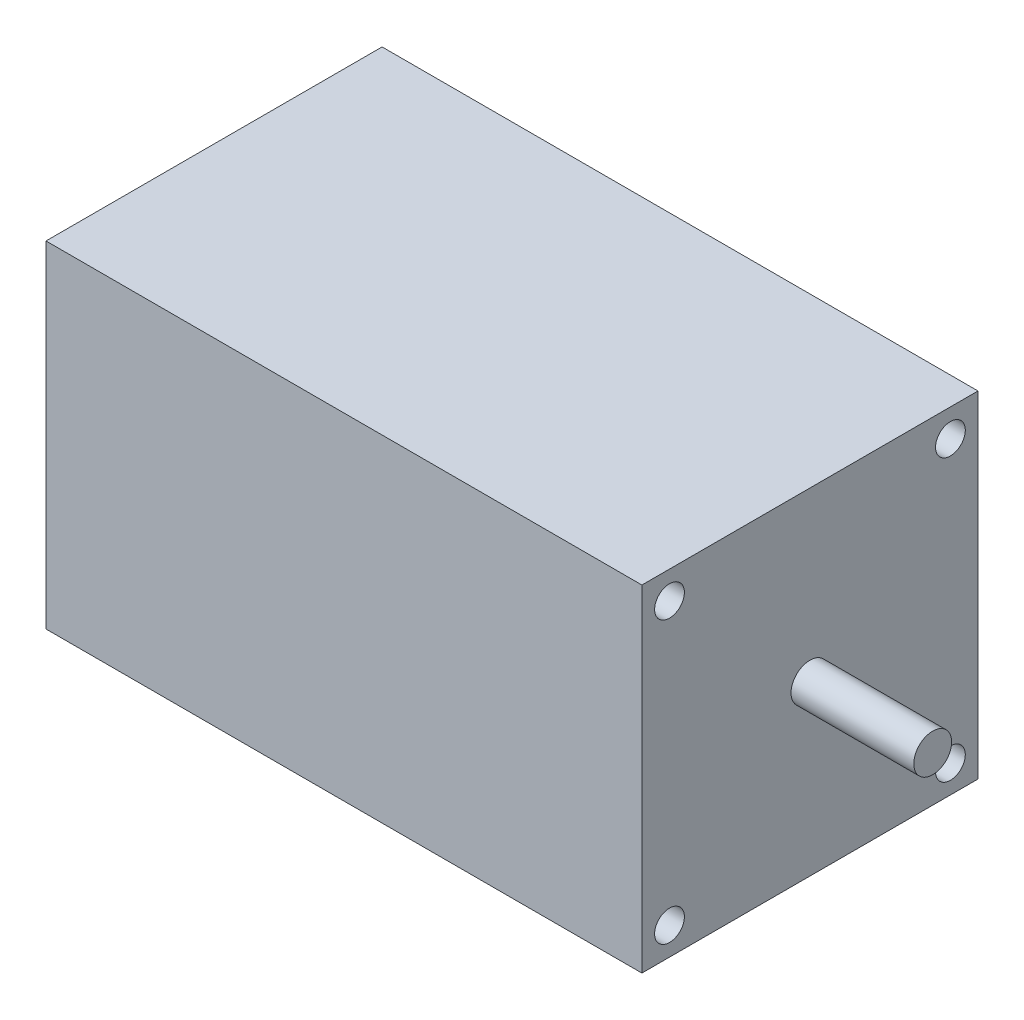
ISO-10303-21;
HEADER;
FILE_DESCRIPTION(('STEP AP214'),'2;1');
FILE_NAME('part.step','',(''),(''),'','','');
FILE_SCHEMA(('AUTOMOTIVE_DESIGN { 1 0 10303 214 1 1 1 1 }'));
ENDSEC;
DATA;
#1=APPLICATION_CONTEXT('core data for automotive mechanical design processes');
#2=APPLICATION_PROTOCOL_DEFINITION('international standard','automotive_design',2000,#1);
#3=PRODUCT_CONTEXT('',#1,'mechanical');
#4=PRODUCT('Part','Part','',(#3));
#5=PRODUCT_RELATED_PRODUCT_CATEGORY('part','',(#4));
#6=PRODUCT_DEFINITION_FORMATION('','',#4);
#7=PRODUCT_DEFINITION_CONTEXT('part definition',#1,'design');
#8=PRODUCT_DEFINITION('design','',#6,#7);
#9=PRODUCT_DEFINITION_SHAPE('','',#8);
#10=(LENGTH_UNIT() NAMED_UNIT(*) SI_UNIT(.MILLI.,.METRE.));
#11=(NAMED_UNIT(*) PLANE_ANGLE_UNIT() SI_UNIT($,.RADIAN.));
#12=(NAMED_UNIT(*) SI_UNIT($,.STERADIAN.) SOLID_ANGLE_UNIT());
#13=UNCERTAINTY_MEASURE_WITH_UNIT(LENGTH_MEASURE(1.E-05),#10,'distance_accuracy_value','');
#14=(GEOMETRIC_REPRESENTATION_CONTEXT(3) GLOBAL_UNCERTAINTY_ASSIGNED_CONTEXT((#13)) GLOBAL_UNIT_ASSIGNED_CONTEXT((#10,
#11,#12)) REPRESENTATION_CONTEXT('',''));
#15=CARTESIAN_POINT('',(0.,0.,0.));
#16=DIRECTION('',(0.,0.,1.));
#17=DIRECTION('',(1.,0.,0.));
#18=AXIS2_PLACEMENT_3D('',#15,#16,#17);
#19=CARTESIAN_POINT('',(-100.,-28.2,-28.2));
#20=DIRECTION('',(0.,0.,-1.));
#21=DIRECTION('',(-1.,0.,0.));
#22=AXIS2_PLACEMENT_3D('',#19,#20,#21);
#23=PLANE('',#22);
#24=DIRECTION('',(0.,1.,0.));
#25=VECTOR('',#24,1.);
#26=CARTESIAN_POINT('',(0.,-28.2,-28.2));
#27=LINE('',#26,#25);
#28=CARTESIAN_POINT('',(0.,-28.2,-28.2));
#29=VERTEX_POINT('',#28);
#30=CARTESIAN_POINT('',(0.,28.2,-28.2));
#31=VERTEX_POINT('',#30);
#32=EDGE_CURVE('E112',#29,#31,#27,.T.);
#33=ORIENTED_EDGE('',*,*,#32,.F.);
#34=DIRECTION('',(1.,0.,0.));
#35=VECTOR('',#34,1.);
#36=CARTESIAN_POINT('',(-100.,-28.2,-28.2));
#37=LINE('',#36,#35);
#38=CARTESIAN_POINT('',(-100.,-28.2,-28.2));
#39=VERTEX_POINT('',#38);
#40=EDGE_CURVE('E48',#39,#29,#37,.T.);
#41=ORIENTED_EDGE('',*,*,#40,.F.);
#42=DIRECTION('',(0.,1.,0.));
#43=VECTOR('',#42,1.);
#44=CARTESIAN_POINT('',(-100.,-28.2,-28.2));
#45=LINE('',#44,#43);
#46=CARTESIAN_POINT('',(-100.,28.2,-28.2));
#47=VERTEX_POINT('',#46);
#48=EDGE_CURVE('E103',#39,#47,#45,.T.);
#49=ORIENTED_EDGE('',*,*,#48,.T.);
#50=DIRECTION('',(1.,0.,0.));
#51=VECTOR('',#50,1.);
#52=CARTESIAN_POINT('',(-100.,28.2,-28.2));
#53=LINE('',#52,#51);
#54=EDGE_CURVE('E83',#47,#31,#53,.T.);
#55=ORIENTED_EDGE('',*,*,#54,.T.);
#56=EDGE_LOOP('',(#33,#41,#49,#55));
#57=FACE_BOUND('',#56,.T.);
#58=ADVANCED_FACE('F39',(#57),#23,.T.);
#59=CARTESIAN_POINT('',(-100.,-28.2,28.2));
#60=DIRECTION('',(0.,-1.,0.));
#61=DIRECTION('',(0.,0.,-1.));
#62=AXIS2_PLACEMENT_3D('',#59,#60,#61);
#63=PLANE('',#62);
#64=DIRECTION('',(0.,0.,-1.));
#65=VECTOR('',#64,1.);
#66=CARTESIAN_POINT('',(0.,-28.2,28.2));
#67=LINE('',#66,#65);
#68=CARTESIAN_POINT('',(0.,-28.2,28.2));
#69=VERTEX_POINT('',#68);
#70=EDGE_CURVE('E106',#69,#29,#67,.T.);
#71=ORIENTED_EDGE('',*,*,#70,.F.);
#72=DIRECTION('',(1.,0.,0.));
#73=VECTOR('',#72,1.);
#74=CARTESIAN_POINT('',(-100.,-28.2,28.2));
#75=LINE('',#74,#73);
#76=CARTESIAN_POINT('',(-100.,-28.2,28.2));
#77=VERTEX_POINT('',#76);
#78=EDGE_CURVE('E72',#77,#69,#75,.T.);
#79=ORIENTED_EDGE('',*,*,#78,.F.);
#80=DIRECTION('',(0.,0.,-1.));
#81=VECTOR('',#80,1.);
#82=CARTESIAN_POINT('',(-100.,-28.2,28.2));
#83=LINE('',#82,#81);
#84=EDGE_CURVE('E98',#77,#39,#83,.T.);
#85=ORIENTED_EDGE('',*,*,#84,.T.);
#86=ORIENTED_EDGE('',*,*,#40,.T.);
#87=EDGE_LOOP('',(#71,#79,#85,#86));
#88=FACE_BOUND('',#87,.T.);
#89=ADVANCED_FACE('F131',(#88),#63,.T.);
#90=CARTESIAN_POINT('',(-100.,-28.2,28.2));
#91=DIRECTION('',(0.,0.,1.));
#92=DIRECTION('',(1.,0.,0.));
#93=AXIS2_PLACEMENT_3D('',#90,#91,#92);
#94=PLANE('',#93);
#95=DIRECTION('',(0.,-1.,0.));
#96=VECTOR('',#95,1.);
#97=CARTESIAN_POINT('',(0.,-28.2,28.2));
#98=LINE('',#97,#96);
#99=CARTESIAN_POINT('',(0.,28.2,28.2));
#100=VERTEX_POINT('',#99);
#101=EDGE_CURVE('E91',#100,#69,#98,.T.);
#102=ORIENTED_EDGE('',*,*,#101,.F.);
#103=DIRECTION('',(1.,0.,0.));
#104=VECTOR('',#103,1.);
#105=CARTESIAN_POINT('',(-100.,28.2,28.2));
#106=LINE('',#105,#104);
#107=CARTESIAN_POINT('',(-100.,28.2,28.2));
#108=VERTEX_POINT('',#107);
#109=EDGE_CURVE('E86',#108,#100,#106,.T.);
#110=ORIENTED_EDGE('',*,*,#109,.F.);
#111=DIRECTION('',(0.,-1.,0.));
#112=VECTOR('',#111,1.);
#113=CARTESIAN_POINT('',(-100.,-28.2,28.2));
#114=LINE('',#113,#112);
#115=EDGE_CURVE('E89',#108,#77,#114,.T.);
#116=ORIENTED_EDGE('',*,*,#115,.T.);
#117=ORIENTED_EDGE('',*,*,#78,.T.);
#118=EDGE_LOOP('',(#102,#110,#116,#117));
#119=FACE_BOUND('',#118,.T.);
#120=ADVANCED_FACE('F88',(#119),#94,.T.);
#121=CARTESIAN_POINT('',(-100.,28.2,28.2));
#122=DIRECTION('',(0.,1.,0.));
#123=DIRECTION('',(0.,0.,1.));
#124=AXIS2_PLACEMENT_3D('',#121,#122,#123);
#125=PLANE('',#124);
#126=DIRECTION('',(0.,0.,1.));
#127=VECTOR('',#126,1.);
#128=CARTESIAN_POINT('',(0.,28.2,28.2));
#129=LINE('',#128,#127);
#130=EDGE_CURVE('E116',#31,#100,#129,.T.);
#131=ORIENTED_EDGE('',*,*,#130,.F.);
#132=ORIENTED_EDGE('',*,*,#54,.F.);
#133=DIRECTION('',(0.,0.,1.));
#134=VECTOR('',#133,1.);
#135=CARTESIAN_POINT('',(-100.,28.2,28.2));
#136=LINE('',#135,#134);
#137=EDGE_CURVE('E97',#47,#108,#136,.T.);
#138=ORIENTED_EDGE('',*,*,#137,.T.);
#139=ORIENTED_EDGE('',*,*,#109,.T.);
#140=EDGE_LOOP('',(#131,#132,#138,#139));
#141=FACE_BOUND('',#140,.T.);
#142=ADVANCED_FACE('F101',(#141),#125,.T.);
#143=CARTESIAN_POINT('',(-100.,0.,0.));
#144=DIRECTION('',(-1.,0.,0.));
#145=DIRECTION('',(0.,0.,1.));
#146=AXIS2_PLACEMENT_3D('',#143,#144,#145);
#147=PLANE('',#146);
#148=CARTESIAN_POINT('',(-100.,-23.57,23.57));
#149=DIRECTION('',(-1.,0.,0.));
#150=DIRECTION('',(0.,0.,1.));
#151=AXIS2_PLACEMENT_3D('',#148,#149,#150);
#152=CIRCLE('',#151,2.5);
#153=CARTESIAN_POINT('',(-100.,-23.57,26.07));
#154=VERTEX_POINT('',#153);
#155=EDGE_CURVE('E186',#154,#154,#152,.F.);
#156=ORIENTED_EDGE('',*,*,#155,.T.);
#157=EDGE_LOOP('',(#156));
#158=FACE_BOUND('',#157,.T.);
#159=CARTESIAN_POINT('',(-100.,-23.57,-23.57));
#160=DIRECTION('',(-1.,0.,0.));
#161=DIRECTION('',(0.,0.,1.));
#162=AXIS2_PLACEMENT_3D('',#159,#160,#161);
#163=CIRCLE('',#162,2.5);
#164=CARTESIAN_POINT('',(-100.,-23.57,-21.07));
#165=VERTEX_POINT('',#164);
#166=EDGE_CURVE('E194',#165,#165,#163,.F.);
#167=ORIENTED_EDGE('',*,*,#166,.T.);
#168=EDGE_LOOP('',(#167));
#169=FACE_BOUND('',#168,.T.);
#170=CARTESIAN_POINT('',(-100.,23.57,-23.57));
#171=DIRECTION('',(-1.,0.,0.));
#172=DIRECTION('',(0.,0.,1.));
#173=AXIS2_PLACEMENT_3D('',#170,#171,#172);
#174=CIRCLE('',#173,2.5);
#175=CARTESIAN_POINT('',(-100.,23.57,-21.07));
#176=VERTEX_POINT('',#175);
#177=EDGE_CURVE('E193',#176,#176,#174,.F.);
#178=ORIENTED_EDGE('',*,*,#177,.T.);
#179=EDGE_LOOP('',(#178));
#180=FACE_BOUND('',#179,.T.);
#181=CARTESIAN_POINT('',(-100.,23.57,23.57));
#182=DIRECTION('',(-1.,0.,0.));
#183=DIRECTION('',(0.,0.,1.));
#184=AXIS2_PLACEMENT_3D('',#181,#182,#183);
#185=CIRCLE('',#184,2.5);
#186=CARTESIAN_POINT('',(-100.,23.57,26.07));
#187=VERTEX_POINT('',#186);
#188=EDGE_CURVE('E117',#187,#187,#185,.F.);
#189=ORIENTED_EDGE('',*,*,#188,.T.);
#190=EDGE_LOOP('',(#189));
#191=FACE_BOUND('',#190,.T.);
#192=ORIENTED_EDGE('',*,*,#48,.F.);
#193=ORIENTED_EDGE('',*,*,#84,.F.);
#194=ORIENTED_EDGE('',*,*,#115,.F.);
#195=ORIENTED_EDGE('',*,*,#137,.F.);
#196=EDGE_LOOP('',(#192,#193,#194,#195));
#197=FACE_BOUND('',#196,.T.);
#198=ADVANCED_FACE('F96',(#158,#169,#180,#191,#197),#147,.T.);
#199=CARTESIAN_POINT('',(0.,0.,0.));
#200=DIRECTION('',(-1.,0.,0.));
#201=DIRECTION('',(0.,0.,1.));
#202=AXIS2_PLACEMENT_3D('',#199,#200,#201);
#203=PLANE('',#202);
#204=CARTESIAN_POINT('',(0.,0.,0.));
#205=DIRECTION('',(-1.,0.,0.));
#206=DIRECTION('',(0.,0.,1.));
#207=AXIS2_PLACEMENT_3D('',#204,#205,#206);
#208=CIRCLE('',#207,3.175);
#209=CARTESIAN_POINT('',(0.,0.,3.175));
#210=VERTEX_POINT('',#209);
#211=EDGE_CURVE('E11',#210,#210,#208,.F.);
#212=ORIENTED_EDGE('',*,*,#211,.F.);
#213=EDGE_LOOP('',(#212));
#214=FACE_BOUND('',#213,.T.);
#215=CARTESIAN_POINT('',(0.,-23.57,23.57));
#216=DIRECTION('',(1.,0.,0.));
#217=DIRECTION('',(0.,0.,1.));
#218=AXIS2_PLACEMENT_3D('',#215,#216,#217);
#219=CIRCLE('',#218,2.5);
#220=CARTESIAN_POINT('',(0.,-23.57,26.07));
#221=VERTEX_POINT('',#220);
#222=EDGE_CURVE('E182',#221,#221,#219,.T.);
#223=ORIENTED_EDGE('',*,*,#222,.F.);
#224=EDGE_LOOP('',(#223));
#225=FACE_BOUND('',#224,.T.);
#226=CARTESIAN_POINT('',(0.,-23.57,-23.57));
#227=DIRECTION('',(1.,0.,0.));
#228=DIRECTION('',(0.,0.,-1.));
#229=AXIS2_PLACEMENT_3D('',#226,#227,#228);
#230=CIRCLE('',#229,2.5);
#231=CARTESIAN_POINT('',(0.,-23.57,-26.07));
#232=VERTEX_POINT('',#231);
#233=EDGE_CURVE('E199',#232,#232,#230,.T.);
#234=ORIENTED_EDGE('',*,*,#233,.F.);
#235=EDGE_LOOP('',(#234));
#236=FACE_BOUND('',#235,.T.);
#237=CARTESIAN_POINT('',(0.,23.57,-23.57));
#238=DIRECTION('',(1.,0.,0.));
#239=DIRECTION('',(0.,0.,1.));
#240=AXIS2_PLACEMENT_3D('',#237,#238,#239);
#241=CIRCLE('',#240,2.5);
#242=CARTESIAN_POINT('',(0.,23.57,-21.07));
#243=VERTEX_POINT('',#242);
#244=EDGE_CURVE('E189',#243,#243,#241,.T.);
#245=ORIENTED_EDGE('',*,*,#244,.F.);
#246=EDGE_LOOP('',(#245));
#247=FACE_BOUND('',#246,.T.);
#248=CARTESIAN_POINT('',(0.,23.57,23.57));
#249=DIRECTION('',(1.,0.,0.));
#250=DIRECTION('',(0.,0.,-1.));
#251=AXIS2_PLACEMENT_3D('',#248,#249,#250);
#252=CIRCLE('',#251,2.5);
#253=CARTESIAN_POINT('',(0.,23.57,21.07));
#254=VERTEX_POINT('',#253);
#255=EDGE_CURVE('E198',#254,#254,#252,.T.);
#256=ORIENTED_EDGE('',*,*,#255,.F.);
#257=EDGE_LOOP('',(#256));
#258=FACE_BOUND('',#257,.T.);
#259=ORIENTED_EDGE('',*,*,#32,.T.);
#260=ORIENTED_EDGE('',*,*,#130,.T.);
#261=ORIENTED_EDGE('',*,*,#101,.T.);
#262=ORIENTED_EDGE('',*,*,#70,.T.);
#263=EDGE_LOOP('',(#259,#260,#261,#262));
#264=FACE_BOUND('',#263,.T.);
#265=ADVANCED_FACE('F130',(#214,#225,#236,#247,#258,#264),#203,.F.);
#266=CARTESIAN_POINT('',(-107.071067811865,23.57,23.57));
#267=DIRECTION('',(1.,0.,0.));
#268=DIRECTION('',(0.,0.,-1.));
#269=AXIS2_PLACEMENT_3D('',#266,#267,#268);
#270=CYLINDRICAL_SURFACE('',#269,2.5);
#271=ORIENTED_EDGE('',*,*,#255,.T.);
#272=EDGE_LOOP('',(#271));
#273=FACE_BOUND('',#272,.T.);
#274=ORIENTED_EDGE('',*,*,#188,.F.);
#275=EDGE_LOOP('',(#274));
#276=FACE_BOUND('',#275,.T.);
#277=ADVANCED_FACE('F149',(#273,#276),#270,.F.);
#278=CARTESIAN_POINT('',(-107.071067811865,23.57,-23.57));
#279=DIRECTION('',(1.,0.,0.));
#280=DIRECTION('',(0.,0.,-1.));
#281=AXIS2_PLACEMENT_3D('',#278,#279,#280);
#282=CYLINDRICAL_SURFACE('',#281,2.5);
#283=ORIENTED_EDGE('',*,*,#244,.T.);
#284=EDGE_LOOP('',(#283));
#285=FACE_BOUND('',#284,.T.);
#286=ORIENTED_EDGE('',*,*,#177,.F.);
#287=EDGE_LOOP('',(#286));
#288=FACE_BOUND('',#287,.T.);
#289=ADVANCED_FACE('F156',(#285,#288),#282,.F.);
#290=CARTESIAN_POINT('',(-107.071067811865,-23.57,-23.57));
#291=DIRECTION('',(1.,0.,0.));
#292=DIRECTION('',(0.,0.,-1.));
#293=AXIS2_PLACEMENT_3D('',#290,#291,#292);
#294=CYLINDRICAL_SURFACE('',#293,2.5);
#295=ORIENTED_EDGE('',*,*,#233,.T.);
#296=EDGE_LOOP('',(#295));
#297=FACE_BOUND('',#296,.T.);
#298=ORIENTED_EDGE('',*,*,#166,.F.);
#299=EDGE_LOOP('',(#298));
#300=FACE_BOUND('',#299,.T.);
#301=ADVANCED_FACE('F162',(#297,#300),#294,.F.);
#302=CARTESIAN_POINT('',(-107.071067811865,-23.57,23.57));
#303=DIRECTION('',(1.,0.,0.));
#304=DIRECTION('',(0.,0.,-1.));
#305=AXIS2_PLACEMENT_3D('',#302,#303,#304);
#306=CYLINDRICAL_SURFACE('',#305,2.5);
#307=ORIENTED_EDGE('',*,*,#222,.T.);
#308=EDGE_LOOP('',(#307));
#309=FACE_BOUND('',#308,.T.);
#310=ORIENTED_EDGE('',*,*,#155,.F.);
#311=EDGE_LOOP('',(#310));
#312=FACE_BOUND('',#311,.T.);
#313=ADVANCED_FACE('F158',(#309,#312),#306,.F.);
#314=CARTESIAN_POINT('',(20.6,0.,0.));
#315=DIRECTION('',(-1.,0.,0.));
#316=DIRECTION('',(0.,0.,1.));
#317=AXIS2_PLACEMENT_3D('',#314,#315,#316);
#318=CYLINDRICAL_SURFACE('',#317,3.175);
#319=CARTESIAN_POINT('',(20.6,0.,0.));
#320=DIRECTION('',(1.,0.,0.));
#321=DIRECTION('',(0.,0.,-1.));
#322=AXIS2_PLACEMENT_3D('',#319,#320,#321);
#323=CIRCLE('',#322,3.175);
#324=CARTESIAN_POINT('',(20.6,0.,3.175));
#325=VERTEX_POINT('',#324);
#326=EDGE_CURVE('E180',#325,#325,#323,.T.);
#327=CARTESIAN_POINT('',(20.6,0.,3.175));
#328=CARTESIAN_POINT('',(20.3854166666667,0.,3.175));
#329=CARTESIAN_POINT('',(20.1708333333333,0.,3.175));
#330=CARTESIAN_POINT('',(19.7416666666667,0.,3.175));
#331=CARTESIAN_POINT('',(19.5270833333333,0.,3.175));
#332=CARTESIAN_POINT('',(19.0979166666667,0.,3.175));
#333=CARTESIAN_POINT('',(18.8833333333333,0.,3.175));
#334=CARTESIAN_POINT('',(18.4541666666667,0.,3.175));
#335=CARTESIAN_POINT('',(18.2395833333333,0.,3.175));
#336=CARTESIAN_POINT('',(17.8104166666667,0.,3.175));
#337=CARTESIAN_POINT('',(17.5958333333333,0.,3.175));
#338=CARTESIAN_POINT('',(17.1666666666667,0.,3.175));
#339=CARTESIAN_POINT('',(16.9520833333333,0.,3.175));
#340=CARTESIAN_POINT('',(16.5229166666667,0.,3.175));
#341=CARTESIAN_POINT('',(16.3083333333333,0.,3.175));
#342=CARTESIAN_POINT('',(15.8791666666667,0.,3.175));
#343=CARTESIAN_POINT('',(15.6645833333333,0.,3.175));
#344=CARTESIAN_POINT('',(15.2354166666667,0.,3.175));
#345=CARTESIAN_POINT('',(15.0208333333333,0.,3.175));
#346=CARTESIAN_POINT('',(14.5916666666667,0.,3.175));
#347=CARTESIAN_POINT('',(14.3770833333333,0.,3.175));
#348=CARTESIAN_POINT('',(13.9479166666667,0.,3.175));
#349=CARTESIAN_POINT('',(13.7333333333333,0.,3.175));
#350=CARTESIAN_POINT('',(13.3041666666667,0.,3.175));
#351=CARTESIAN_POINT('',(13.0895833333333,0.,3.175));
#352=CARTESIAN_POINT('',(12.6604166666667,0.,3.175));
#353=CARTESIAN_POINT('',(12.4458333333333,0.,3.175));
#354=CARTESIAN_POINT('',(12.0166666666667,0.,3.175));
#355=CARTESIAN_POINT('',(11.8020833333333,0.,3.175));
#356=CARTESIAN_POINT('',(11.3729166666667,0.,3.175));
#357=CARTESIAN_POINT('',(11.1583333333333,0.,3.175));
#358=CARTESIAN_POINT('',(10.7291666666667,0.,3.175));
#359=CARTESIAN_POINT('',(10.5145833333333,0.,3.175));
#360=CARTESIAN_POINT('',(10.0854166666667,0.,3.175));
#361=CARTESIAN_POINT('',(9.87083333333334,0.,3.175));
#362=CARTESIAN_POINT('',(9.44166666666667,0.,3.175));
#363=CARTESIAN_POINT('',(9.22708333333333,0.,3.175));
#364=CARTESIAN_POINT('',(8.79791666666667,0.,3.175));
#365=CARTESIAN_POINT('',(8.58333333333334,0.,3.175));
#366=CARTESIAN_POINT('',(8.15416666666667,0.,3.175));
#367=CARTESIAN_POINT('',(7.93958333333334,0.,3.175));
#368=CARTESIAN_POINT('',(7.51041666666667,0.,3.175));
#369=CARTESIAN_POINT('',(7.29583333333334,0.,3.175));
#370=CARTESIAN_POINT('',(6.86666666666667,0.,3.175));
#371=CARTESIAN_POINT('',(6.65208333333334,0.,3.175));
#372=CARTESIAN_POINT('',(6.22291666666667,0.,3.175));
#373=CARTESIAN_POINT('',(6.00833333333334,0.,3.175));
#374=CARTESIAN_POINT('',(5.57916666666667,0.,3.175));
#375=CARTESIAN_POINT('',(5.36458333333333,0.,3.175));
#376=CARTESIAN_POINT('',(4.93541666666667,0.,3.175));
#377=CARTESIAN_POINT('',(4.72083333333334,0.,3.175));
#378=CARTESIAN_POINT('',(4.29166666666667,0.,3.175));
#379=CARTESIAN_POINT('',(4.07708333333334,0.,3.175));
#380=CARTESIAN_POINT('',(3.64791666666667,0.,3.175));
#381=CARTESIAN_POINT('',(3.43333333333334,0.,3.175));
#382=CARTESIAN_POINT('',(3.00416666666667,0.,3.175));
#383=CARTESIAN_POINT('',(2.78958333333334,0.,3.175));
#384=CARTESIAN_POINT('',(2.36041666666667,0.,3.175));
#385=CARTESIAN_POINT('',(2.14583333333334,0.,3.175));
#386=CARTESIAN_POINT('',(1.71666666666667,0.,3.175));
#387=CARTESIAN_POINT('',(1.50208333333334,0.,3.175));
#388=CARTESIAN_POINT('',(1.07291666666667,0.,3.175));
#389=CARTESIAN_POINT('',(0.858333333333336,0.,3.175));
#390=CARTESIAN_POINT('',(0.429166666666669,0.,3.175));
#391=CARTESIAN_POINT('',(0.214583333333336,0.,3.175));
#392=CARTESIAN_POINT('',(0.,0.,3.175));
#393=B_SPLINE_CURVE_WITH_KNOTS('',3,(#327,#328,#329,#330,#331,#332,#333,#334,#335,#336,#337,
#338,#339,#340,#341,#342,#343,#344,#345,#346,#347,#348,#349,#350,#351,#352,#353,#354,#355,#356,
#357,#358,#359,#360,#361,#362,#363,#364,#365,#366,#367,#368,#369,#370,#371,#372,#373,#374,#375,
#376,#377,#378,#379,#380,#381,#382,#383,#384,#385,#386,#387,#388,#389,#390,#391,#392),
.UNSPECIFIED.,.F.,.F.,(4,2,2,2,2,2,2,2,2,2,2,2,2,2,2,2,2,2,2,2,2,2,2,2,2,2,2,2,2,2,2,2,4),(0.,
0.643749999999998,1.2875,1.93125,2.575,3.21875,3.8625,4.50625,5.15,5.79375,6.4375,7.08125,7.725,
8.36875,9.01249999999999,9.65624999999999,10.3,10.94375,11.5875,12.23125,12.875,13.51875,
14.1625,14.80625,15.45,16.09375,16.7375,17.38125,18.025,18.66875,19.3125,19.95625,20.6),.UNSPECIFIED.);
#394=EDGE_CURVE('BSEAM161',#325,#210,#393,.T.);
#395=ORIENTED_EDGE('',*,*,#326,.F.);
#396=ORIENTED_EDGE('',*,*,#211,.T.);
#397=ORIENTED_EDGE('',*,*,#394,.T.);
#398=ORIENTED_EDGE('',*,*,#394,.F.);
#399=EDGE_LOOP('',(#395,#397,#396,#398));
#400=FACE_BOUND('',#399,.T.);
#401=ADVANCED_FACE('F161',(#400),#318,.T.);
#402=CARTESIAN_POINT('',(20.6,0.,0.));
#403=DIRECTION('',(1.,0.,0.));
#404=DIRECTION('',(0.,0.,-1.));
#405=AXIS2_PLACEMENT_3D('',#402,#403,#404);
#406=PLANE('',#405);
#407=ORIENTED_EDGE('',*,*,#326,.T.);
#408=EDGE_LOOP('',(#407));
#409=FACE_BOUND('',#408,.T.);
#410=ADVANCED_FACE('F172',(#409),#406,.T.);
#411=CLOSED_SHELL('',(#58,#89,#120,#142,#198,#265,#277,#289,#301,#313,#401,#410));
#412=MANIFOLD_SOLID_BREP('B2',#411);
#413=ADVANCED_BREP_SHAPE_REPRESENTATION('',(#18,#412),#14);
#414=SHAPE_DEFINITION_REPRESENTATION(#9,#413);
ENDSEC;
END-ISO-10303-21;
